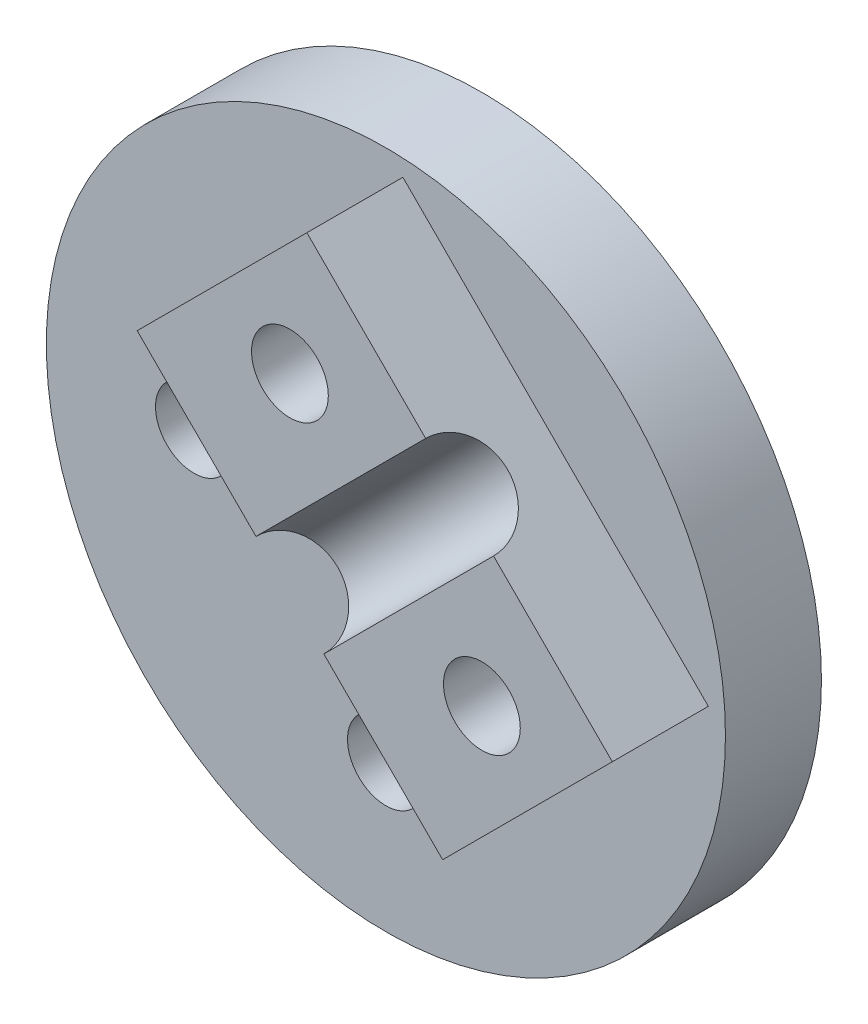
ISO-10303-21;
HEADER;
FILE_DESCRIPTION(('STEP AP214'),'2;1');
FILE_NAME('part.step','',(''),(''),'','','');
FILE_SCHEMA(('AUTOMOTIVE_DESIGN { 1 0 10303 214 1 1 1 1 }'));
ENDSEC;
DATA;
#1=APPLICATION_CONTEXT('core data for automotive mechanical design processes');
#2=APPLICATION_PROTOCOL_DEFINITION('international standard','automotive_design',2000,#1);
#3=PRODUCT_CONTEXT('',#1,'mechanical');
#4=PRODUCT('Part','Part','',(#3));
#5=PRODUCT_RELATED_PRODUCT_CATEGORY('part','',(#4));
#6=PRODUCT_DEFINITION_FORMATION('','',#4);
#7=PRODUCT_DEFINITION_CONTEXT('part definition',#1,'design');
#8=PRODUCT_DEFINITION('design','',#6,#7);
#9=PRODUCT_DEFINITION_SHAPE('','',#8);
#10=(LENGTH_UNIT() NAMED_UNIT(*) SI_UNIT(.MILLI.,.METRE.));
#11=(NAMED_UNIT(*) PLANE_ANGLE_UNIT() SI_UNIT($,.RADIAN.));
#12=(NAMED_UNIT(*) SI_UNIT($,.STERADIAN.) SOLID_ANGLE_UNIT());
#13=UNCERTAINTY_MEASURE_WITH_UNIT(LENGTH_MEASURE(1.E-05),#10,'distance_accuracy_value','');
#14=(GEOMETRIC_REPRESENTATION_CONTEXT(3) GLOBAL_UNCERTAINTY_ASSIGNED_CONTEXT((#13)) GLOBAL_UNIT_ASSIGNED_CONTEXT((#10,
#11,#12)) REPRESENTATION_CONTEXT('',''));
#15=CARTESIAN_POINT('',(0.,0.,0.));
#16=DIRECTION('',(0.,0.,1.));
#17=DIRECTION('',(1.,0.,0.));
#18=AXIS2_PLACEMENT_3D('',#15,#16,#17);
#19=CARTESIAN_POINT('',(0.,0.,4.));
#20=DIRECTION('',(0.,0.,1.));
#21=DIRECTION('',(1.,0.,0.));
#22=AXIS2_PLACEMENT_3D('',#19,#20,#21);
#23=PLANE('',#22);
#24=DIRECTION('',(-0.707106781186546,0.707106781186549,0.));
#25=VECTOR('',#24,1.);
#26=CARTESIAN_POINT('',(7.07106781186549,7.07106781186546,4.));
#27=LINE('',#26,#25);
#28=CARTESIAN_POINT('',(13.4350288425444,0.707106781186524,4.));
#29=VERTEX_POINT('',#28);
#30=CARTESIAN_POINT('',(0.707106781186568,13.4350288425444,4.));
#31=VERTEX_POINT('',#30);
#32=EDGE_CURVE('E108',#29,#31,#27,.T.);
#33=ORIENTED_EDGE('',*,*,#32,.F.);
#34=DIRECTION('',(-0.707106781186549,-0.707106781186546,0.));
#35=VECTOR('',#34,1.);
#36=CARTESIAN_POINT('',(13.4350288425444,0.707106781186524,4.));
#37=LINE('',#36,#35);
#38=CARTESIAN_POINT('',(6.36396103067892,-6.36396103067894,4.));
#39=VERTEX_POINT('',#38);
#40=EDGE_CURVE('E132',#29,#39,#37,.T.);
#41=ORIENTED_EDGE('',*,*,#40,.T.);
#42=DIRECTION('',(-0.707106781186546,0.707106781186549,0.));
#43=VECTOR('',#42,1.);
#44=CARTESIAN_POINT('',(0.,0.,4.));
#45=LINE('',#44,#43);
#46=CARTESIAN_POINT('',(-6.36396103067892,6.36396103067894,4.));
#47=VERTEX_POINT('',#46);
#48=EDGE_CURVE('E130',#39,#47,#45,.T.);
#49=ORIENTED_EDGE('',*,*,#48,.T.);
#50=DIRECTION('',(-0.707106781186549,-0.707106781186546,0.));
#51=VECTOR('',#50,1.);
#52=CARTESIAN_POINT('',(0.707106781186568,13.4350288425444,4.));
#53=LINE('',#52,#51);
#54=EDGE_CURVE('E123',#31,#47,#53,.T.);
#55=ORIENTED_EDGE('',*,*,#54,.F.);
#56=EDGE_LOOP('',(#33,#41,#49,#55));
#57=FACE_BOUND('',#56,.T.);
#58=CARTESIAN_POINT('',(0.,-8.,4.));
#59=DIRECTION('',(0.,0.,1.));
#60=DIRECTION('',(1.,0.,0.));
#61=AXIS2_PLACEMENT_3D('',#58,#59,#60);
#62=CIRCLE('',#61,1.6);
#63=CARTESIAN_POINT('',(1.6,-8.,4.));
#64=VERTEX_POINT('',#63);
#65=EDGE_CURVE('E163',#64,#64,#62,.T.);
#66=ORIENTED_EDGE('',*,*,#65,.F.);
#67=EDGE_LOOP('',(#66));
#68=FACE_BOUND('',#67,.T.);
#69=CARTESIAN_POINT('',(0.,0.,4.));
#70=DIRECTION('',(0.,0.,1.));
#71=DIRECTION('',(1.,0.,0.));
#72=AXIS2_PLACEMENT_3D('',#69,#70,#71);
#73=CIRCLE('',#72,14.1493085385358);
#74=CARTESIAN_POINT('',(14.1493085385358,0.,4.));
#75=VERTEX_POINT('',#74);
#76=EDGE_CURVE('E11',#75,#75,#73,.T.);
#77=ORIENTED_EDGE('',*,*,#76,.T.);
#78=EDGE_LOOP('',(#77));
#79=FACE_BOUND('',#78,.T.);
#80=CARTESIAN_POINT('',(-8.,0.,4.));
#81=DIRECTION('',(0.,0.,1.));
#82=DIRECTION('',(1.,0.,0.));
#83=AXIS2_PLACEMENT_3D('',#80,#81,#82);
#84=CIRCLE('',#83,1.6);
#85=CARTESIAN_POINT('',(-6.4,0.,4.));
#86=VERTEX_POINT('',#85);
#87=EDGE_CURVE('E147',#86,#86,#84,.T.);
#88=ORIENTED_EDGE('',*,*,#87,.F.);
#89=EDGE_LOOP('',(#88));
#90=FACE_BOUND('',#89,.T.);
#91=ADVANCED_FACE('F47',(#57,#68,#79,#90),#23,.T.);
#92=CARTESIAN_POINT('',(0.,0.,0.));
#93=DIRECTION('',(0.,0.,1.));
#94=DIRECTION('',(1.,0.,0.));
#95=AXIS2_PLACEMENT_3D('',#92,#93,#94);
#96=PLANE('',#95);
#97=CARTESIAN_POINT('',(0.,0.,0.));
#98=DIRECTION('',(0.,0.,1.));
#99=DIRECTION('',(1.,0.,0.));
#100=AXIS2_PLACEMENT_3D('',#97,#98,#99);
#101=CIRCLE('',#100,14.1493085385358);
#102=CARTESIAN_POINT('',(14.1493085385358,0.,0.));
#103=VERTEX_POINT('',#102);
#104=EDGE_CURVE('E51',#103,#103,#101,.T.);
#105=ORIENTED_EDGE('',*,*,#104,.F.);
#106=EDGE_LOOP('',(#105));
#107=FACE_BOUND('',#106,.T.);
#108=CARTESIAN_POINT('',(0.,-8.,0.));
#109=DIRECTION('',(0.,0.,1.));
#110=DIRECTION('',(1.,0.,0.));
#111=AXIS2_PLACEMENT_3D('',#108,#109,#110);
#112=CIRCLE('',#111,1.6);
#113=CARTESIAN_POINT('',(1.6,-8.,0.));
#114=VERTEX_POINT('',#113);
#115=EDGE_CURVE('E162',#114,#114,#112,.T.);
#116=ORIENTED_EDGE('',*,*,#115,.T.);
#117=EDGE_LOOP('',(#116));
#118=FACE_BOUND('',#117,.T.);
#119=CARTESIAN_POINT('',(8.,0.,0.));
#120=DIRECTION('',(0.,0.,1.));
#121=DIRECTION('',(1.,0.,0.));
#122=AXIS2_PLACEMENT_3D('',#119,#120,#121);
#123=CIRCLE('',#122,1.6);
#124=CARTESIAN_POINT('',(9.6,0.,0.));
#125=VERTEX_POINT('',#124);
#126=EDGE_CURVE('E158',#125,#125,#123,.T.);
#127=ORIENTED_EDGE('',*,*,#126,.T.);
#128=EDGE_LOOP('',(#127));
#129=FACE_BOUND('',#128,.T.);
#130=CARTESIAN_POINT('',(0.,8.,0.));
#131=DIRECTION('',(0.,0.,1.));
#132=DIRECTION('',(1.,0.,0.));
#133=AXIS2_PLACEMENT_3D('',#130,#131,#132);
#134=CIRCLE('',#133,1.6);
#135=CARTESIAN_POINT('',(1.6,8.,0.));
#136=VERTEX_POINT('',#135);
#137=EDGE_CURVE('E151',#136,#136,#134,.T.);
#138=ORIENTED_EDGE('',*,*,#137,.T.);
#139=EDGE_LOOP('',(#138));
#140=FACE_BOUND('',#139,.T.);
#141=CARTESIAN_POINT('',(-8.,0.,0.));
#142=DIRECTION('',(0.,0.,1.));
#143=DIRECTION('',(1.,0.,0.));
#144=AXIS2_PLACEMENT_3D('',#141,#142,#143);
#145=CIRCLE('',#144,1.6);
#146=CARTESIAN_POINT('',(-6.4,0.,0.));
#147=VERTEX_POINT('',#146);
#148=EDGE_CURVE('E146',#147,#147,#145,.T.);
#149=ORIENTED_EDGE('',*,*,#148,.T.);
#150=EDGE_LOOP('',(#149));
#151=FACE_BOUND('',#150,.T.);
#152=ADVANCED_FACE('F171',(#107,#118,#129,#140,#151),#96,.F.);
#153=CARTESIAN_POINT('',(0.,0.,4.));
#154=DIRECTION('',(0.,0.,-1.));
#155=DIRECTION('',(-1.,0.,0.));
#156=AXIS2_PLACEMENT_3D('',#153,#154,#155);
#157=CYLINDRICAL_SURFACE('',#156,14.1493085385358);
#158=ORIENTED_EDGE('',*,*,#76,.F.);
#159=EDGE_LOOP('',(#158));
#160=FACE_BOUND('',#159,.T.);
#161=ORIENTED_EDGE('',*,*,#104,.T.);
#162=EDGE_LOOP('',(#161));
#163=FACE_BOUND('',#162,.T.);
#164=ADVANCED_FACE('F49',(#160,#163),#157,.T.);
#165=CARTESIAN_POINT('',(0.,-8.,4.));
#166=DIRECTION('',(0.,0.,-1.));
#167=DIRECTION('',(-1.,0.,0.));
#168=AXIS2_PLACEMENT_3D('',#165,#166,#167);
#169=CYLINDRICAL_SURFACE('',#168,1.6);
#170=ORIENTED_EDGE('',*,*,#65,.T.);
#171=EDGE_LOOP('',(#170));
#172=FACE_BOUND('',#171,.T.);
#173=ORIENTED_EDGE('',*,*,#115,.F.);
#174=EDGE_LOOP('',(#173));
#175=FACE_BOUND('',#174,.T.);
#176=ADVANCED_FACE('F174',(#172,#175),#169,.F.);
#177=CARTESIAN_POINT('',(8.,0.,4.));
#178=DIRECTION('',(0.,0.,-1.));
#179=DIRECTION('',(-1.,0.,0.));
#180=AXIS2_PLACEMENT_3D('',#177,#178,#179);
#181=CYLINDRICAL_SURFACE('',#180,1.6);
#182=ORIENTED_EDGE('',*,*,#126,.F.);
#183=EDGE_LOOP('',(#182));
#184=FACE_BOUND('',#183,.T.);
#185=CARTESIAN_POINT('',(8.,0.,8.));
#186=DIRECTION('',(0.,0.,1.));
#187=DIRECTION('',(1.,0.,0.));
#188=AXIS2_PLACEMENT_3D('',#185,#186,#187);
#189=CIRCLE('',#188,1.6);
#190=CARTESIAN_POINT('',(9.6,0.,8.));
#191=VERTEX_POINT('',#190);
#192=EDGE_CURVE('E314',#191,#191,#189,.T.);
#193=ORIENTED_EDGE('',*,*,#192,.T.);
#194=EDGE_LOOP('',(#193));
#195=FACE_BOUND('',#194,.T.);
#196=ADVANCED_FACE('F176',(#184,#195),#181,.F.);
#197=CARTESIAN_POINT('',(0.,8.,4.));
#198=DIRECTION('',(0.,0.,-1.));
#199=DIRECTION('',(-1.,0.,0.));
#200=AXIS2_PLACEMENT_3D('',#197,#198,#199);
#201=CYLINDRICAL_SURFACE('',#200,1.6);
#202=ORIENTED_EDGE('',*,*,#137,.F.);
#203=EDGE_LOOP('',(#202));
#204=FACE_BOUND('',#203,.T.);
#205=CARTESIAN_POINT('',(0.,8.,8.));
#206=DIRECTION('',(0.,0.,1.));
#207=DIRECTION('',(1.,0.,0.));
#208=AXIS2_PLACEMENT_3D('',#205,#206,#207);
#209=CIRCLE('',#208,1.6);
#210=CARTESIAN_POINT('',(1.6,8.,8.));
#211=VERTEX_POINT('',#210);
#212=EDGE_CURVE('E321',#211,#211,#209,.T.);
#213=ORIENTED_EDGE('',*,*,#212,.T.);
#214=EDGE_LOOP('',(#213));
#215=FACE_BOUND('',#214,.T.);
#216=ADVANCED_FACE('F184',(#204,#215),#201,.F.);
#217=CARTESIAN_POINT('',(-8.,0.,4.));
#218=DIRECTION('',(0.,0.,-1.));
#219=DIRECTION('',(-1.,0.,0.));
#220=AXIS2_PLACEMENT_3D('',#217,#218,#219);
#221=CYLINDRICAL_SURFACE('',#220,1.6);
#222=ORIENTED_EDGE('',*,*,#87,.T.);
#223=EDGE_LOOP('',(#222));
#224=FACE_BOUND('',#223,.T.);
#225=ORIENTED_EDGE('',*,*,#148,.F.);
#226=EDGE_LOOP('',(#225));
#227=FACE_BOUND('',#226,.T.);
#228=ADVANCED_FACE('F230',(#224,#227),#221,.F.);
#229=CARTESIAN_POINT('',(7.07106781186549,7.07106781186546,8.));
#230=DIRECTION('',(-0.707106781186549,-0.707106781186546,0.));
#231=DIRECTION('',(0.707106781186546,-0.707106781186549,0.));
#232=AXIS2_PLACEMENT_3D('',#229,#230,#231);
#233=CYLINDRICAL_SURFACE('',#232,2.);
#234=CARTESIAN_POINT('',(0.,0.,8.));
#235=DIRECTION('',(0.707106781186549,0.707106781186546,0.));
#236=DIRECTION('',(-0.707106781186546,0.707106781186549,0.));
#237=AXIS2_PLACEMENT_3D('',#234,#235,#236);
#238=CIRCLE('',#237,2.);
#239=CARTESIAN_POINT('',(1.41421356237309,-1.4142135623731,8.));
#240=VERTEX_POINT('',#239);
#241=CARTESIAN_POINT('',(-1.41421356237309,1.4142135623731,8.));
#242=VERTEX_POINT('',#241);
#243=EDGE_CURVE('E309',#240,#242,#238,.T.);
#244=ORIENTED_EDGE('',*,*,#243,.F.);
#245=DIRECTION('',(-0.707106781186549,-0.707106781186546,0.));
#246=VECTOR('',#245,1.);
#247=CARTESIAN_POINT('',(8.48528137423858,5.65685424949237,8.));
#248=LINE('',#247,#246);
#249=CARTESIAN_POINT('',(8.48528137423858,5.65685424949237,8.));
#250=VERTEX_POINT('',#249);
#251=EDGE_CURVE('E99',#250,#240,#248,.T.);
#252=ORIENTED_EDGE('',*,*,#251,.F.);
#253=CARTESIAN_POINT('',(7.07106781186549,7.07106781186546,8.));
#254=DIRECTION('',(0.707106781186549,0.707106781186546,0.));
#255=DIRECTION('',(-0.707106781186546,0.707106781186549,0.));
#256=AXIS2_PLACEMENT_3D('',#253,#254,#255);
#257=CIRCLE('',#256,2.);
#258=CARTESIAN_POINT('',(5.6568542494924,8.48528137423856,8.));
#259=VERTEX_POINT('',#258);
#260=EDGE_CURVE('E332',#250,#259,#257,.T.);
#261=ORIENTED_EDGE('',*,*,#260,.T.);
#262=DIRECTION('',(-0.707106781186549,-0.707106781186546,0.));
#263=VECTOR('',#262,1.);
#264=CARTESIAN_POINT('',(5.6568542494924,8.48528137423856,8.));
#265=LINE('',#264,#263);
#266=EDGE_CURVE('E94',#259,#242,#265,.T.);
#267=ORIENTED_EDGE('',*,*,#266,.T.);
#268=EDGE_LOOP('',(#244,#252,#261,#267));
#269=FACE_BOUND('',#268,.T.);
#270=ADVANCED_FACE('F240',(#269),#233,.F.);
#271=CARTESIAN_POINT('',(7.07106781186549,7.07106781186546,8.));
#272=DIRECTION('',(0.,0.,-1.));
#273=DIRECTION('',(-1.,0.,0.));
#274=AXIS2_PLACEMENT_3D('',#271,#272,#273);
#275=PLANE('',#274);
#276=ORIENTED_EDGE('',*,*,#192,.F.);
#277=EDGE_LOOP('',(#276));
#278=FACE_BOUND('',#277,.T.);
#279=DIRECTION('',(0.707106781186546,-0.707106781186549,0.));
#280=VECTOR('',#279,1.);
#281=CARTESIAN_POINT('',(0.,0.,8.));
#282=LINE('',#281,#280);
#283=CARTESIAN_POINT('',(6.36396103067892,-6.36396103067894,8.));
#284=VERTEX_POINT('',#283);
#285=EDGE_CURVE('E312',#240,#284,#282,.T.);
#286=ORIENTED_EDGE('',*,*,#285,.T.);
#287=DIRECTION('',(-0.707106781186549,-0.707106781186546,0.));
#288=VECTOR('',#287,1.);
#289=CARTESIAN_POINT('',(13.4350288425444,0.707106781186525,8.));
#290=LINE('',#289,#288);
#291=CARTESIAN_POINT('',(13.4350288425444,0.707106781186525,8.));
#292=VERTEX_POINT('',#291);
#293=EDGE_CURVE('E136',#292,#284,#290,.T.);
#294=ORIENTED_EDGE('',*,*,#293,.F.);
#295=DIRECTION('',(0.707106781186546,-0.707106781186549,0.));
#296=VECTOR('',#295,1.);
#297=CARTESIAN_POINT('',(7.07106781186549,7.07106781186546,8.));
#298=LINE('',#297,#296);
#299=EDGE_CURVE('E337',#250,#292,#298,.T.);
#300=ORIENTED_EDGE('',*,*,#299,.F.);
#301=ORIENTED_EDGE('',*,*,#251,.T.);
#302=EDGE_LOOP('',(#286,#294,#300,#301));
#303=FACE_BOUND('',#302,.T.);
#304=ADVANCED_FACE('F249',(#278,#303),#275,.F.);
#305=CARTESIAN_POINT('',(13.4350288425444,0.707106781186524,0.));
#306=DIRECTION('',(-0.707106781186546,0.707106781186549,0.));
#307=DIRECTION('',(-0.707106781186549,-0.707106781186546,0.));
#308=AXIS2_PLACEMENT_3D('',#305,#306,#307);
#309=PLANE('',#308);
#310=DIRECTION('',(0.,0.,-1.));
#311=VECTOR('',#310,1.);
#312=CARTESIAN_POINT('',(6.36396103067892,-6.36396103067894,0.));
#313=LINE('',#312,#311);
#314=EDGE_CURVE('E318',#284,#39,#313,.T.);
#315=ORIENTED_EDGE('',*,*,#314,.T.);
#316=ORIENTED_EDGE('',*,*,#40,.F.);
#317=DIRECTION('',(0.,0.,-1.));
#318=VECTOR('',#317,1.);
#319=CARTESIAN_POINT('',(13.4350288425444,0.707106781186524,0.));
#320=LINE('',#319,#318);
#321=EDGE_CURVE('E114',#292,#29,#320,.T.);
#322=ORIENTED_EDGE('',*,*,#321,.F.);
#323=ORIENTED_EDGE('',*,*,#293,.T.);
#324=EDGE_LOOP('',(#315,#316,#322,#323));
#325=FACE_BOUND('',#324,.T.);
#326=ADVANCED_FACE('F259',(#325),#309,.F.);
#327=CARTESIAN_POINT('',(0.707106781186567,13.4350288425444,0.));
#328=DIRECTION('',(0.707106781186546,-0.707106781186549,0.));
#329=DIRECTION('',(0.707106781186549,0.707106781186546,0.));
#330=AXIS2_PLACEMENT_3D('',#327,#328,#329);
#331=PLANE('',#330);
#332=DIRECTION('',(0.,0.,1.));
#333=VECTOR('',#332,1.);
#334=CARTESIAN_POINT('',(-6.36396103067892,6.36396103067894,0.));
#335=LINE('',#334,#333);
#336=CARTESIAN_POINT('',(-6.36396103067892,6.36396103067894,8.));
#337=VERTEX_POINT('',#336);
#338=EDGE_CURVE('E63',#47,#337,#335,.T.);
#339=ORIENTED_EDGE('',*,*,#338,.T.);
#340=DIRECTION('',(-0.707106781186549,-0.707106781186546,0.));
#341=VECTOR('',#340,1.);
#342=CARTESIAN_POINT('',(0.707106781186568,13.4350288425444,8.));
#343=LINE('',#342,#341);
#344=CARTESIAN_POINT('',(0.707106781186568,13.4350288425444,8.));
#345=VERTEX_POINT('',#344);
#346=EDGE_CURVE('E126',#345,#337,#343,.T.);
#347=ORIENTED_EDGE('',*,*,#346,.F.);
#348=DIRECTION('',(0.,0.,1.));
#349=VECTOR('',#348,1.);
#350=CARTESIAN_POINT('',(0.707106781186567,13.4350288425444,0.));
#351=LINE('',#350,#349);
#352=EDGE_CURVE('E111',#31,#345,#351,.T.);
#353=ORIENTED_EDGE('',*,*,#352,.F.);
#354=ORIENTED_EDGE('',*,*,#54,.T.);
#355=EDGE_LOOP('',(#339,#347,#353,#354));
#356=FACE_BOUND('',#355,.T.);
#357=ADVANCED_FACE('F122',(#356),#331,.F.);
#358=CARTESIAN_POINT('',(7.07106781186549,7.07106781186546,8.));
#359=DIRECTION('',(0.,0.,-1.));
#360=DIRECTION('',(0.,1.,0.));
#361=AXIS2_PLACEMENT_3D('',#358,#359,#360);
#362=PLANE('',#361);
#363=ORIENTED_EDGE('',*,*,#212,.F.);
#364=EDGE_LOOP('',(#363));
#365=FACE_BOUND('',#364,.T.);
#366=DIRECTION('',(0.707106781186546,-0.707106781186549,0.));
#367=VECTOR('',#366,1.);
#368=CARTESIAN_POINT('',(0.,0.,8.));
#369=LINE('',#368,#367);
#370=EDGE_CURVE('E310',#337,#242,#369,.T.);
#371=ORIENTED_EDGE('',*,*,#370,.T.);
#372=ORIENTED_EDGE('',*,*,#266,.F.);
#373=DIRECTION('',(0.707106781186546,-0.707106781186549,0.));
#374=VECTOR('',#373,1.);
#375=CARTESIAN_POINT('',(7.07106781186549,7.07106781186546,8.));
#376=LINE('',#375,#374);
#377=EDGE_CURVE('E72',#345,#259,#376,.T.);
#378=ORIENTED_EDGE('',*,*,#377,.F.);
#379=ORIENTED_EDGE('',*,*,#346,.T.);
#380=EDGE_LOOP('',(#371,#372,#378,#379));
#381=FACE_BOUND('',#380,.T.);
#382=ADVANCED_FACE('F278',(#365,#381),#362,.F.);
#383=CARTESIAN_POINT('',(7.07106781186549,7.07106781186546,0.));
#384=DIRECTION('',(0.707106781186549,0.707106781186546,0.));
#385=DIRECTION('',(-0.707106781186546,0.707106781186549,0.));
#386=AXIS2_PLACEMENT_3D('',#383,#384,#385);
#387=PLANE('',#386);
#388=ORIENTED_EDGE('',*,*,#260,.F.);
#389=ORIENTED_EDGE('',*,*,#299,.T.);
#390=ORIENTED_EDGE('',*,*,#321,.T.);
#391=ORIENTED_EDGE('',*,*,#32,.T.);
#392=ORIENTED_EDGE('',*,*,#352,.T.);
#393=ORIENTED_EDGE('',*,*,#377,.T.);
#394=EDGE_LOOP('',(#388,#389,#390,#391,#392,#393));
#395=FACE_BOUND('',#394,.T.);
#396=ADVANCED_FACE('F110',(#395),#387,.T.);
#397=CARTESIAN_POINT('',(0.,0.,0.));
#398=DIRECTION('',(0.707106781186549,0.707106781186546,0.));
#399=DIRECTION('',(-0.707106781186546,0.707106781186549,0.));
#400=AXIS2_PLACEMENT_3D('',#397,#398,#399);
#401=PLANE('',#400);
#402=ORIENTED_EDGE('',*,*,#243,.T.);
#403=ORIENTED_EDGE('',*,*,#370,.F.);
#404=ORIENTED_EDGE('',*,*,#338,.F.);
#405=ORIENTED_EDGE('',*,*,#48,.F.);
#406=ORIENTED_EDGE('',*,*,#314,.F.);
#407=ORIENTED_EDGE('',*,*,#285,.F.);
#408=EDGE_LOOP('',(#402,#403,#404,#405,#406,#407));
#409=FACE_BOUND('',#408,.T.);
#410=ADVANCED_FACE('F294',(#409),#401,.F.);
#411=CLOSED_SHELL('',(#91,#152,#164,#176,#196,#216,#228,#270,#304,#326,#357,#382,#396,#410));
#412=MANIFOLD_SOLID_BREP('B2',#411);
#413=ADVANCED_BREP_SHAPE_REPRESENTATION('',(#18,#412),#14);
#414=SHAPE_DEFINITION_REPRESENTATION(#9,#413);
ENDSEC;
END-ISO-10303-21;
